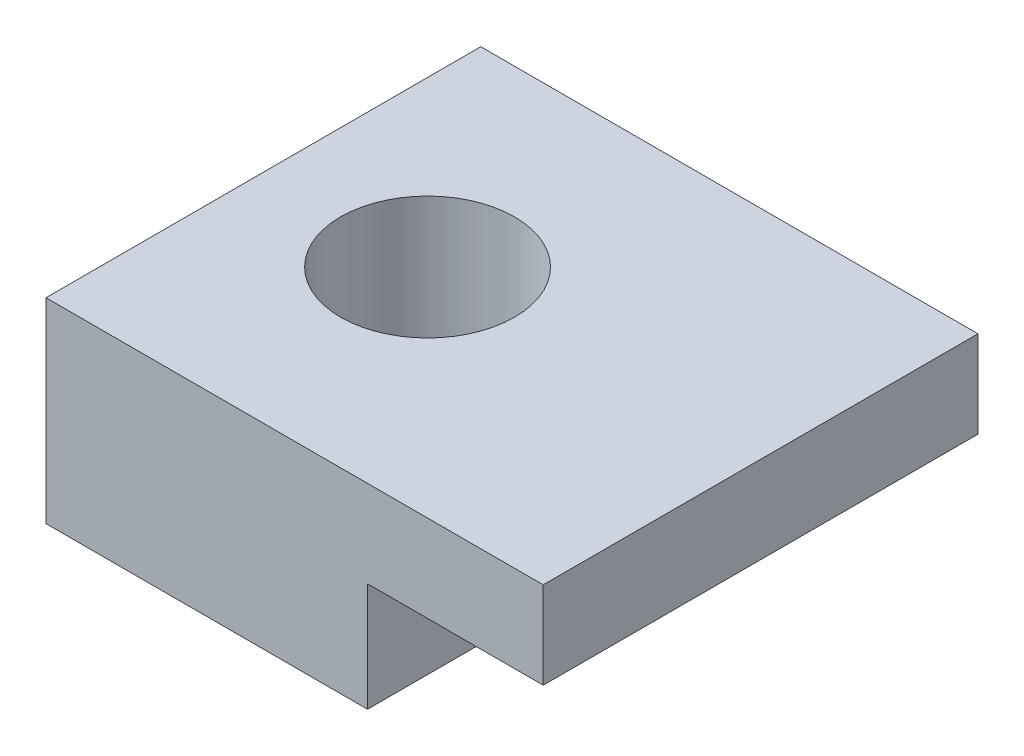
ISO-10303-21;
HEADER;
FILE_DESCRIPTION(('STEP AP214'),'2;1');
FILE_NAME('part.step','',(''),(''),'','','');
FILE_SCHEMA(('AUTOMOTIVE_DESIGN { 1 0 10303 214 1 1 1 1 }'));
ENDSEC;
DATA;
#1=APPLICATION_CONTEXT('core data for automotive mechanical design processes');
#2=APPLICATION_PROTOCOL_DEFINITION('international standard','automotive_design',2000,#1);
#3=PRODUCT_CONTEXT('',#1,'mechanical');
#4=PRODUCT('Part','Part','',(#3));
#5=PRODUCT_RELATED_PRODUCT_CATEGORY('part','',(#4));
#6=PRODUCT_DEFINITION_FORMATION('','',#4);
#7=PRODUCT_DEFINITION_CONTEXT('part definition',#1,'design');
#8=PRODUCT_DEFINITION('design','',#6,#7);
#9=PRODUCT_DEFINITION_SHAPE('','',#8);
#10=(LENGTH_UNIT() NAMED_UNIT(*) SI_UNIT(.MILLI.,.METRE.));
#11=(NAMED_UNIT(*) PLANE_ANGLE_UNIT() SI_UNIT($,.RADIAN.));
#12=(NAMED_UNIT(*) SI_UNIT($,.STERADIAN.) SOLID_ANGLE_UNIT());
#13=UNCERTAINTY_MEASURE_WITH_UNIT(LENGTH_MEASURE(1.E-05),#10,'distance_accuracy_value','');
#14=(GEOMETRIC_REPRESENTATION_CONTEXT(3) GLOBAL_UNCERTAINTY_ASSIGNED_CONTEXT((#13)) GLOBAL_UNIT_ASSIGNED_CONTEXT((#10,
#11,#12)) REPRESENTATION_CONTEXT('',''));
#15=CARTESIAN_POINT('',(0.,0.,0.));
#16=DIRECTION('',(0.,0.,1.));
#17=DIRECTION('',(1.,0.,0.));
#18=AXIS2_PLACEMENT_3D('',#15,#16,#17);
#19=CARTESIAN_POINT('',(3.61878404643993,0.,10.));
#20=DIRECTION('',(0.,1.,0.));
#21=DIRECTION('',(0.,0.,1.));
#22=AXIS2_PLACEMENT_3D('',#19,#20,#21);
#23=PLANE('',#22);
#24=CARTESIAN_POINT('',(0.,0.,5.));
#25=DIRECTION('',(0.,1.,0.));
#26=DIRECTION('',(0.,0.,1.));
#27=AXIS2_PLACEMENT_3D('',#24,#25,#26);
#28=CIRCLE('',#27,2.);
#29=CARTESIAN_POINT('',(0.,0.,7.));
#30=VERTEX_POINT('',#29);
#31=EDGE_CURVE('E121',#30,#30,#28,.T.);
#32=ORIENTED_EDGE('',*,*,#31,.T.);
#33=EDGE_LOOP('',(#32));
#34=FACE_BOUND('',#33,.T.);
#35=DIRECTION('',(1.,0.,0.));
#36=VECTOR('',#35,1.);
#37=CARTESIAN_POINT('',(3.61878404643993,0.,0.));
#38=LINE('',#37,#36);
#39=CARTESIAN_POINT('',(-3.77633599508599,0.,0.));
#40=VERTEX_POINT('',#39);
#41=CARTESIAN_POINT('',(3.61878404643993,0.,0.));
#42=VERTEX_POINT('',#41);
#43=EDGE_CURVE('E117',#40,#42,#38,.T.);
#44=ORIENTED_EDGE('',*,*,#43,.T.);
#45=DIRECTION('',(0.,0.,-1.));
#46=VECTOR('',#45,1.);
#47=CARTESIAN_POINT('',(3.61878404643993,0.,10.));
#48=LINE('',#47,#46);
#49=CARTESIAN_POINT('',(3.61878404643993,0.,10.));
#50=VERTEX_POINT('',#49);
#51=EDGE_CURVE('E11',#50,#42,#48,.T.);
#52=ORIENTED_EDGE('',*,*,#51,.F.);
#53=DIRECTION('',(1.,0.,0.));
#54=VECTOR('',#53,1.);
#55=CARTESIAN_POINT('',(3.61878404643993,0.,10.));
#56=LINE('',#55,#54);
#57=CARTESIAN_POINT('',(-3.77633599508599,0.,10.));
#58=VERTEX_POINT('',#57);
#59=EDGE_CURVE('E128',#58,#50,#56,.T.);
#60=ORIENTED_EDGE('',*,*,#59,.F.);
#61=DIRECTION('',(0.,0.,-1.));
#62=VECTOR('',#61,1.);
#63=CARTESIAN_POINT('',(-3.77633599508599,0.,10.));
#64=LINE('',#63,#62);
#65=EDGE_CURVE('E113',#58,#40,#64,.T.);
#66=ORIENTED_EDGE('',*,*,#65,.T.);
#67=EDGE_LOOP('',(#44,#52,#60,#66));
#68=FACE_BOUND('',#67,.T.);
#69=ADVANCED_FACE('F33',(#34,#68),#23,.F.);
#70=CARTESIAN_POINT('',(3.61878404643993,2.5,10.));
#71=DIRECTION('',(-1.,0.,0.));
#72=DIRECTION('',(0.,-1.,0.));
#73=AXIS2_PLACEMENT_3D('',#70,#71,#72);
#74=PLANE('',#73);
#75=DIRECTION('',(0.,1.,0.));
#76=VECTOR('',#75,1.);
#77=CARTESIAN_POINT('',(3.61878404643993,2.5,0.));
#78=LINE('',#77,#76);
#79=CARTESIAN_POINT('',(3.61878404643993,2.5,0.));
#80=VERTEX_POINT('',#79);
#81=EDGE_CURVE('E120',#42,#80,#78,.T.);
#82=ORIENTED_EDGE('',*,*,#81,.T.);
#83=DIRECTION('',(0.,0.,-1.));
#84=VECTOR('',#83,1.);
#85=CARTESIAN_POINT('',(3.61878404643993,2.5,10.));
#86=LINE('',#85,#84);
#87=CARTESIAN_POINT('',(3.61878404643993,2.5,10.));
#88=VERTEX_POINT('',#87);
#89=EDGE_CURVE('E41',#88,#80,#86,.T.);
#90=ORIENTED_EDGE('',*,*,#89,.F.);
#91=DIRECTION('',(0.,1.,0.));
#92=VECTOR('',#91,1.);
#93=CARTESIAN_POINT('',(3.61878404643993,2.5,10.));
#94=LINE('',#93,#92);
#95=EDGE_CURVE('E86',#50,#88,#94,.T.);
#96=ORIENTED_EDGE('',*,*,#95,.F.);
#97=ORIENTED_EDGE('',*,*,#51,.T.);
#98=EDGE_LOOP('',(#82,#90,#96,#97));
#99=FACE_BOUND('',#98,.T.);
#100=ADVANCED_FACE('F153',(#99),#74,.F.);
#101=CARTESIAN_POINT('',(7.66019050618237,2.5,10.));
#102=DIRECTION('',(0.,1.,0.));
#103=DIRECTION('',(0.,0.,1.));
#104=AXIS2_PLACEMENT_3D('',#101,#102,#103);
#105=PLANE('',#104);
#106=DIRECTION('',(1.,0.,0.));
#107=VECTOR('',#106,1.);
#108=CARTESIAN_POINT('',(7.66019050618237,2.5,0.));
#109=LINE('',#108,#107);
#110=CARTESIAN_POINT('',(7.66019050618237,2.5,0.));
#111=VERTEX_POINT('',#110);
#112=EDGE_CURVE('E123',#80,#111,#109,.T.);
#113=ORIENTED_EDGE('',*,*,#112,.T.);
#114=DIRECTION('',(0.,0.,-1.));
#115=VECTOR('',#114,1.);
#116=CARTESIAN_POINT('',(7.66019050618237,2.5,10.));
#117=LINE('',#116,#115);
#118=CARTESIAN_POINT('',(7.66019050618237,2.5,10.));
#119=VERTEX_POINT('',#118);
#120=EDGE_CURVE('E108',#119,#111,#117,.T.);
#121=ORIENTED_EDGE('',*,*,#120,.F.);
#122=DIRECTION('',(1.,0.,0.));
#123=VECTOR('',#122,1.);
#124=CARTESIAN_POINT('',(7.66019050618237,2.5,10.));
#125=LINE('',#124,#123);
#126=EDGE_CURVE('E99',#88,#119,#125,.T.);
#127=ORIENTED_EDGE('',*,*,#126,.F.);
#128=ORIENTED_EDGE('',*,*,#89,.T.);
#129=EDGE_LOOP('',(#113,#121,#127,#128));
#130=FACE_BOUND('',#129,.T.);
#131=ADVANCED_FACE('F134',(#130),#105,.F.);
#132=CARTESIAN_POINT('',(7.66019050618237,4.5,10.));
#133=DIRECTION('',(-1.,0.,0.));
#134=DIRECTION('',(0.,-1.,0.));
#135=AXIS2_PLACEMENT_3D('',#132,#133,#134);
#136=PLANE('',#135);
#137=DIRECTION('',(0.,1.,0.));
#138=VECTOR('',#137,1.);
#139=CARTESIAN_POINT('',(7.66019050618237,4.5,0.));
#140=LINE('',#139,#138);
#141=CARTESIAN_POINT('',(7.66019050618237,4.5,0.));
#142=VERTEX_POINT('',#141);
#143=EDGE_CURVE('E107',#111,#142,#140,.T.);
#144=ORIENTED_EDGE('',*,*,#143,.T.);
#145=DIRECTION('',(0.,0.,-1.));
#146=VECTOR('',#145,1.);
#147=CARTESIAN_POINT('',(7.66019050618237,4.5,10.));
#148=LINE('',#147,#146);
#149=CARTESIAN_POINT('',(7.66019050618237,4.5,10.));
#150=VERTEX_POINT('',#149);
#151=EDGE_CURVE('E104',#150,#142,#148,.T.);
#152=ORIENTED_EDGE('',*,*,#151,.F.);
#153=DIRECTION('',(0.,1.,0.));
#154=VECTOR('',#153,1.);
#155=CARTESIAN_POINT('',(7.66019050618237,4.5,10.));
#156=LINE('',#155,#154);
#157=EDGE_CURVE('E93',#119,#150,#156,.T.);
#158=ORIENTED_EDGE('',*,*,#157,.F.);
#159=ORIENTED_EDGE('',*,*,#120,.T.);
#160=EDGE_LOOP('',(#144,#152,#158,#159));
#161=FACE_BOUND('',#160,.T.);
#162=ADVANCED_FACE('F105',(#161),#136,.F.);
#163=CARTESIAN_POINT('',(-3.77633599508599,4.5,10.));
#164=DIRECTION('',(0.,-1.,0.));
#165=DIRECTION('',(0.,0.,-1.));
#166=AXIS2_PLACEMENT_3D('',#163,#164,#165);
#167=PLANE('',#166);
#168=CARTESIAN_POINT('',(0.,4.5,5.));
#169=DIRECTION('',(0.,1.,0.));
#170=DIRECTION('',(0.,0.,1.));
#171=AXIS2_PLACEMENT_3D('',#168,#169,#170);
#172=CIRCLE('',#171,2.);
#173=CARTESIAN_POINT('',(0.,4.5,7.));
#174=VERTEX_POINT('',#173);
#175=EDGE_CURVE('E161',#174,#174,#172,.T.);
#176=ORIENTED_EDGE('',*,*,#175,.F.);
#177=EDGE_LOOP('',(#176));
#178=FACE_BOUND('',#177,.T.);
#179=DIRECTION('',(-1.,0.,0.));
#180=VECTOR('',#179,1.);
#181=CARTESIAN_POINT('',(-3.77633599508599,4.5,0.));
#182=LINE('',#181,#180);
#183=CARTESIAN_POINT('',(-3.77633599508599,4.5,0.));
#184=VERTEX_POINT('',#183);
#185=EDGE_CURVE('E72',#142,#184,#182,.T.);
#186=ORIENTED_EDGE('',*,*,#185,.T.);
#187=DIRECTION('',(0.,0.,-1.));
#188=VECTOR('',#187,1.);
#189=CARTESIAN_POINT('',(-3.77633599508599,4.5,10.));
#190=LINE('',#189,#188);
#191=CARTESIAN_POINT('',(-3.77633599508599,4.5,10.));
#192=VERTEX_POINT('',#191);
#193=EDGE_CURVE('E109',#192,#184,#190,.T.);
#194=ORIENTED_EDGE('',*,*,#193,.F.);
#195=DIRECTION('',(-1.,0.,0.));
#196=VECTOR('',#195,1.);
#197=CARTESIAN_POINT('',(-3.77633599508599,4.5,10.));
#198=LINE('',#197,#196);
#199=EDGE_CURVE('E97',#150,#192,#198,.T.);
#200=ORIENTED_EDGE('',*,*,#199,.F.);
#201=ORIENTED_EDGE('',*,*,#151,.T.);
#202=EDGE_LOOP('',(#186,#194,#200,#201));
#203=FACE_BOUND('',#202,.T.);
#204=ADVANCED_FACE('F111',(#178,#203),#167,.F.);
#205=CARTESIAN_POINT('',(-3.77633599508599,0.,10.));
#206=DIRECTION('',(1.,0.,0.));
#207=DIRECTION('',(0.,0.,-1.));
#208=AXIS2_PLACEMENT_3D('',#205,#206,#207);
#209=PLANE('',#208);
#210=DIRECTION('',(0.,-1.,0.));
#211=VECTOR('',#210,1.);
#212=CARTESIAN_POINT('',(-3.77633599508599,0.,0.));
#213=LINE('',#212,#211);
#214=EDGE_CURVE('E78',#184,#40,#213,.T.);
#215=ORIENTED_EDGE('',*,*,#214,.T.);
#216=ORIENTED_EDGE('',*,*,#65,.F.);
#217=DIRECTION('',(0.,-1.,0.));
#218=VECTOR('',#217,1.);
#219=CARTESIAN_POINT('',(-3.77633599508599,0.,10.));
#220=LINE('',#219,#218);
#221=EDGE_CURVE('E49',#192,#58,#220,.T.);
#222=ORIENTED_EDGE('',*,*,#221,.F.);
#223=ORIENTED_EDGE('',*,*,#193,.T.);
#224=EDGE_LOOP('',(#215,#216,#222,#223));
#225=FACE_BOUND('',#224,.T.);
#226=ADVANCED_FACE('F141',(#225),#209,.F.);
#227=CARTESIAN_POINT('',(0.,0.,10.));
#228=DIRECTION('',(0.,0.,-1.));
#229=DIRECTION('',(-1.,0.,0.));
#230=AXIS2_PLACEMENT_3D('',#227,#228,#229);
#231=PLANE('',#230);
#232=ORIENTED_EDGE('',*,*,#59,.T.);
#233=ORIENTED_EDGE('',*,*,#95,.T.);
#234=ORIENTED_EDGE('',*,*,#126,.T.);
#235=ORIENTED_EDGE('',*,*,#157,.T.);
#236=ORIENTED_EDGE('',*,*,#199,.T.);
#237=ORIENTED_EDGE('',*,*,#221,.T.);
#238=EDGE_LOOP('',(#232,#233,#234,#235,#236,#237));
#239=FACE_BOUND('',#238,.T.);
#240=ADVANCED_FACE('F95',(#239),#231,.F.);
#241=CARTESIAN_POINT('',(0.,0.,0.));
#242=DIRECTION('',(0.,0.,-1.));
#243=DIRECTION('',(-1.,0.,0.));
#244=AXIS2_PLACEMENT_3D('',#241,#242,#243);
#245=PLANE('',#244);
#246=ORIENTED_EDGE('',*,*,#43,.F.);
#247=ORIENTED_EDGE('',*,*,#214,.F.);
#248=ORIENTED_EDGE('',*,*,#185,.F.);
#249=ORIENTED_EDGE('',*,*,#143,.F.);
#250=ORIENTED_EDGE('',*,*,#112,.F.);
#251=ORIENTED_EDGE('',*,*,#81,.F.);
#252=EDGE_LOOP('',(#246,#247,#248,#249,#250,#251));
#253=FACE_BOUND('',#252,.T.);
#254=ADVANCED_FACE('F137',(#253),#245,.T.);
#255=CARTESIAN_POINT('',(0.,-5.5,5.));
#256=DIRECTION('',(0.,1.,0.));
#257=DIRECTION('',(0.,0.,1.));
#258=AXIS2_PLACEMENT_3D('',#255,#256,#257);
#259=CYLINDRICAL_SURFACE('',#258,2.);
#260=ORIENTED_EDGE('',*,*,#175,.T.);
#261=EDGE_LOOP('',(#260));
#262=FACE_BOUND('',#261,.T.);
#263=ORIENTED_EDGE('',*,*,#31,.F.);
#264=EDGE_LOOP('',(#263));
#265=FACE_BOUND('',#264,.T.);
#266=ADVANCED_FACE('F169',(#262,#265),#259,.F.);
#267=CLOSED_SHELL('',(#69,#100,#131,#162,#204,#226,#240,#254,#266));
#268=MANIFOLD_SOLID_BREP('B2',#267);
#269=ADVANCED_BREP_SHAPE_REPRESENTATION('',(#18,#268),#14);
#270=SHAPE_DEFINITION_REPRESENTATION(#9,#269);
ENDSEC;
END-ISO-10303-21;
